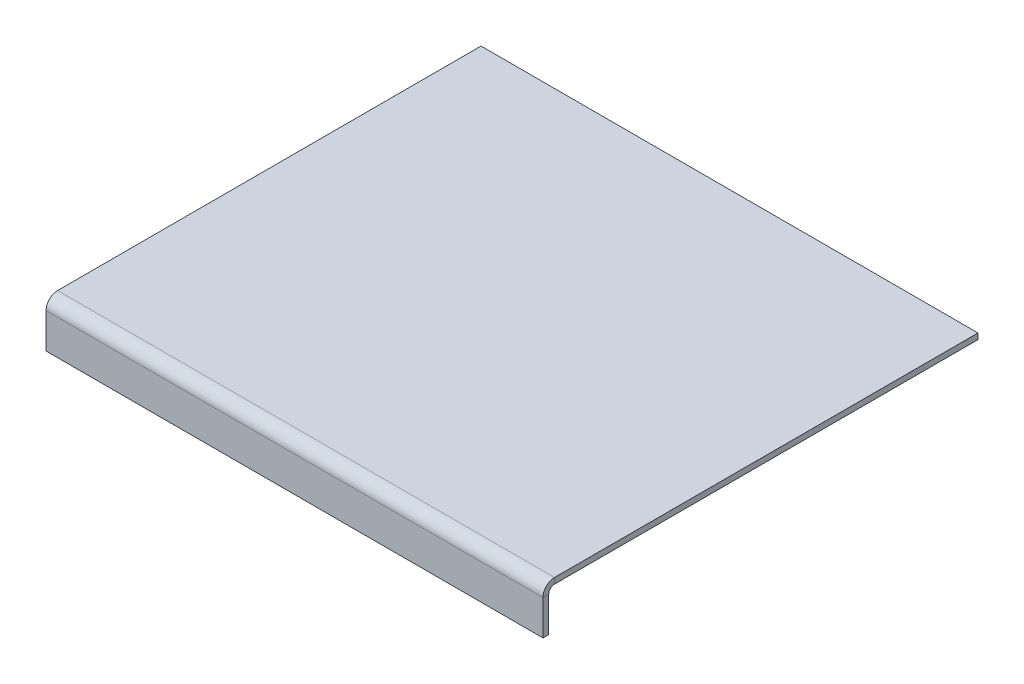
ISO-10303-21;
HEADER;
FILE_DESCRIPTION(('STEP AP214'),'2;1');
FILE_NAME('part.step','',(''),(''),'','','');
FILE_SCHEMA(('AUTOMOTIVE_DESIGN { 1 0 10303 214 1 1 1 1 }'));
ENDSEC;
DATA;
#1=APPLICATION_CONTEXT('core data for automotive mechanical design processes');
#2=APPLICATION_PROTOCOL_DEFINITION('international standard','automotive_design',2000,#1);
#3=PRODUCT_CONTEXT('',#1,'mechanical');
#4=PRODUCT('Part','Part','',(#3));
#5=PRODUCT_RELATED_PRODUCT_CATEGORY('part','',(#4));
#6=PRODUCT_DEFINITION_FORMATION('','',#4);
#7=PRODUCT_DEFINITION_CONTEXT('part definition',#1,'design');
#8=PRODUCT_DEFINITION('design','',#6,#7);
#9=PRODUCT_DEFINITION_SHAPE('','',#8);
#10=(LENGTH_UNIT() NAMED_UNIT(*) SI_UNIT(.MILLI.,.METRE.));
#11=(NAMED_UNIT(*) PLANE_ANGLE_UNIT() SI_UNIT($,.RADIAN.));
#12=(NAMED_UNIT(*) SI_UNIT($,.STERADIAN.) SOLID_ANGLE_UNIT());
#13=UNCERTAINTY_MEASURE_WITH_UNIT(LENGTH_MEASURE(1.E-05),#10,'distance_accuracy_value','');
#14=(GEOMETRIC_REPRESENTATION_CONTEXT(3) GLOBAL_UNCERTAINTY_ASSIGNED_CONTEXT((#13)) GLOBAL_UNIT_ASSIGNED_CONTEXT((#10,
#11,#12)) REPRESENTATION_CONTEXT('',''));
#15=CARTESIAN_POINT('',(0.,0.,0.));
#16=DIRECTION('',(0.,0.,1.));
#17=DIRECTION('',(1.,0.,0.));
#18=AXIS2_PLACEMENT_3D('',#15,#16,#17);
#19=CARTESIAN_POINT('',(-101.6,-2.3622,87.757));
#20=DIRECTION('',(-1.,0.,0.));
#21=DIRECTION('',(0.,0.,1.));
#22=AXIS2_PLACEMENT_3D('',#19,#20,#21);
#23=PLANE('',#22);
#24=DIRECTION('',(0.,0.,1.));
#25=VECTOR('',#24,1.);
#26=CARTESIAN_POINT('',(-101.6,-2.3622,87.757));
#27=LINE('',#26,#25);
#28=CARTESIAN_POINT('',(-101.6,-2.3622,-87.757));
#29=VERTEX_POINT('',#28);
#30=CARTESIAN_POINT('',(-101.6,-2.36219999999999,85.3970000000001));
#31=VERTEX_POINT('',#30);
#32=EDGE_CURVE('E96',#29,#31,#27,.T.);
#33=ORIENTED_EDGE('',*,*,#32,.T.);
#34=DIRECTION('',(0.,1.,0.));
#35=VECTOR('',#34,1.);
#36=CARTESIAN_POINT('',(-101.6,-2.36219999999999,85.3970000000001));
#37=LINE('',#36,#35);
#38=CARTESIAN_POINT('',(-101.6,0.,85.3970000000001));
#39=VERTEX_POINT('',#38);
#40=EDGE_CURVE('E87',#31,#39,#37,.T.);
#41=ORIENTED_EDGE('',*,*,#40,.T.);
#42=DIRECTION('',(0.,0.,1.));
#43=VECTOR('',#42,1.);
#44=CARTESIAN_POINT('',(-101.6,0.,87.757));
#45=LINE('',#44,#43);
#46=CARTESIAN_POINT('',(-101.6,0.,-87.757));
#47=VERTEX_POINT('',#46);
#48=EDGE_CURVE('E85',#47,#39,#45,.T.);
#49=ORIENTED_EDGE('',*,*,#48,.F.);
#50=DIRECTION('',(0.,1.,0.));
#51=VECTOR('',#50,1.);
#52=CARTESIAN_POINT('',(-101.6,-2.3622,-87.757));
#53=LINE('',#52,#51);
#54=EDGE_CURVE('E11',#29,#47,#53,.T.);
#55=ORIENTED_EDGE('',*,*,#54,.F.);
#56=EDGE_LOOP('',(#33,#41,#49,#55));
#57=FACE_BOUND('',#56,.T.);
#58=ADVANCED_FACE('F43',(#57),#23,.T.);
#59=CARTESIAN_POINT('',(0.,-2.3622,0.));
#60=DIRECTION('',(0.,1.,0.));
#61=DIRECTION('',(0.,0.,1.));
#62=AXIS2_PLACEMENT_3D('',#59,#60,#61);
#63=PLANE('',#62);
#64=DIRECTION('',(-1.,0.,0.));
#65=VECTOR('',#64,1.);
#66=CARTESIAN_POINT('',(-101.6,-2.36219999999999,85.3970000000001));
#67=LINE('',#66,#65);
#68=CARTESIAN_POINT('',(101.6,-2.36219999999999,85.3970000000001));
#69=VERTEX_POINT('',#68);
#70=EDGE_CURVE('E109',#31,#69,#67,.F.);
#71=ORIENTED_EDGE('',*,*,#70,.F.);
#72=ORIENTED_EDGE('',*,*,#32,.F.);
#73=DIRECTION('',(-1.,0.,0.));
#74=VECTOR('',#73,1.);
#75=CARTESIAN_POINT('',(101.6,-2.3622,-87.757));
#76=LINE('',#75,#74);
#77=CARTESIAN_POINT('',(101.6,-2.3622,-87.757));
#78=VERTEX_POINT('',#77);
#79=EDGE_CURVE('E82',#78,#29,#76,.T.);
#80=ORIENTED_EDGE('',*,*,#79,.F.);
#81=DIRECTION('',(0.,0.,-1.));
#82=VECTOR('',#81,1.);
#83=CARTESIAN_POINT('',(101.6,-2.3622,87.757));
#84=LINE('',#83,#82);
#85=EDGE_CURVE('E98',#69,#78,#84,.T.);
#86=ORIENTED_EDGE('',*,*,#85,.F.);
#87=EDGE_LOOP('',(#71,#72,#80,#86));
#88=FACE_BOUND('',#87,.T.);
#89=ADVANCED_FACE('F213',(#88),#63,.F.);
#90=CARTESIAN_POINT('',(0.,0.,0.));
#91=DIRECTION('',(0.,1.,0.));
#92=DIRECTION('',(0.,0.,1.));
#93=AXIS2_PLACEMENT_3D('',#90,#91,#92);
#94=PLANE('',#93);
#95=ORIENTED_EDGE('',*,*,#48,.T.);
#96=DIRECTION('',(-1.,0.,0.));
#97=VECTOR('',#96,1.);
#98=CARTESIAN_POINT('',(-101.6,0.,85.3970000000001));
#99=LINE('',#98,#97);
#100=CARTESIAN_POINT('',(101.6,0.,85.3970000000001));
#101=VERTEX_POINT('',#100);
#102=EDGE_CURVE('E119',#39,#101,#99,.F.);
#103=ORIENTED_EDGE('',*,*,#102,.T.);
#104=DIRECTION('',(0.,0.,-1.));
#105=VECTOR('',#104,1.);
#106=CARTESIAN_POINT('',(101.6,0.,87.757));
#107=LINE('',#106,#105);
#108=CARTESIAN_POINT('',(101.6,0.,-87.757));
#109=VERTEX_POINT('',#108);
#110=EDGE_CURVE('E90',#101,#109,#107,.T.);
#111=ORIENTED_EDGE('',*,*,#110,.T.);
#112=DIRECTION('',(-1.,0.,0.));
#113=VECTOR('',#112,1.);
#114=CARTESIAN_POINT('',(101.6,0.,-87.757));
#115=LINE('',#114,#113);
#116=EDGE_CURVE('E80',#109,#47,#115,.T.);
#117=ORIENTED_EDGE('',*,*,#116,.T.);
#118=EDGE_LOOP('',(#95,#103,#111,#117));
#119=FACE_BOUND('',#118,.T.);
#120=ADVANCED_FACE('F93',(#119),#94,.T.);
#121=CARTESIAN_POINT('',(101.6,-2.3622,-87.757));
#122=DIRECTION('',(0.,0.,-1.));
#123=DIRECTION('',(-1.,0.,0.));
#124=AXIS2_PLACEMENT_3D('',#121,#122,#123);
#125=PLANE('',#124);
#126=ORIENTED_EDGE('',*,*,#116,.F.);
#127=DIRECTION('',(0.,1.,0.));
#128=VECTOR('',#127,1.);
#129=CARTESIAN_POINT('',(101.6,-2.3622,-87.757));
#130=LINE('',#129,#128);
#131=EDGE_CURVE('E46',#78,#109,#130,.T.);
#132=ORIENTED_EDGE('',*,*,#131,.F.);
#133=ORIENTED_EDGE('',*,*,#79,.T.);
#134=ORIENTED_EDGE('',*,*,#54,.T.);
#135=EDGE_LOOP('',(#126,#132,#133,#134));
#136=FACE_BOUND('',#135,.T.);
#137=ADVANCED_FACE('F77',(#136),#125,.T.);
#138=CARTESIAN_POINT('',(101.6,-2.3622,87.757));
#139=DIRECTION('',(1.,0.,0.));
#140=DIRECTION('',(0.,0.,-1.));
#141=AXIS2_PLACEMENT_3D('',#138,#139,#140);
#142=PLANE('',#141);
#143=DIRECTION('',(0.,1.,0.));
#144=VECTOR('',#143,1.);
#145=CARTESIAN_POINT('',(101.6,-2.36219999999999,85.3970000000001));
#146=LINE('',#145,#144);
#147=EDGE_CURVE('E91',#69,#101,#146,.T.);
#148=ORIENTED_EDGE('',*,*,#147,.F.);
#149=ORIENTED_EDGE('',*,*,#85,.T.);
#150=ORIENTED_EDGE('',*,*,#131,.T.);
#151=ORIENTED_EDGE('',*,*,#110,.F.);
#152=EDGE_LOOP('',(#148,#149,#150,#151));
#153=FACE_BOUND('',#152,.T.);
#154=ADVANCED_FACE('F210',(#153),#142,.T.);
#155=CARTESIAN_POINT('',(101.6,-4.72219999999998,85.397));
#156=DIRECTION('',(1.,0.,0.));
#157=DIRECTION('',(0.,0.,-1.));
#158=AXIS2_PLACEMENT_3D('',#155,#156,#157);
#159=PLANE('',#158);
#160=DIRECTION('',(0.,0.,1.));
#161=VECTOR('',#160,1.);
#162=CARTESIAN_POINT('',(101.6,-4.72219999999998,87.757));
#163=LINE('',#162,#161);
#164=CARTESIAN_POINT('',(101.6,-4.72219999999997,87.757));
#165=VERTEX_POINT('',#164);
#166=CARTESIAN_POINT('',(101.6,-4.72219999999997,90.1192));
#167=VERTEX_POINT('',#166);
#168=EDGE_CURVE('E148',#165,#167,#163,.T.);
#169=ORIENTED_EDGE('',*,*,#168,.F.);
#170=CARTESIAN_POINT('',(101.6,-4.72219999999998,85.397));
#171=DIRECTION('',(-1.,0.,0.));
#172=DIRECTION('',(0.,0.,1.));
#173=AXIS2_PLACEMENT_3D('',#170,#171,#172);
#174=CIRCLE('',#173,2.35999999999999);
#175=EDGE_CURVE('E113',#69,#165,#174,.F.);
#176=ORIENTED_EDGE('',*,*,#175,.F.);
#177=ORIENTED_EDGE('',*,*,#147,.T.);
#178=CARTESIAN_POINT('',(101.6,-4.72219999999998,85.397));
#179=DIRECTION('',(-1.,0.,0.));
#180=DIRECTION('',(0.,0.,1.));
#181=AXIS2_PLACEMENT_3D('',#178,#179,#180);
#182=CIRCLE('',#181,4.72219999999999);
#183=EDGE_CURVE('E57',#101,#167,#182,.F.);
#184=ORIENTED_EDGE('',*,*,#183,.T.);
#185=EDGE_LOOP('',(#169,#176,#177,#184));
#186=FACE_BOUND('',#185,.T.);
#187=ADVANCED_FACE('F201',(#186),#159,.T.);
#188=CARTESIAN_POINT('',(-101.6,-4.72219999999998,85.397));
#189=DIRECTION('',(1.,0.,0.));
#190=DIRECTION('',(0.,0.,-1.));
#191=AXIS2_PLACEMENT_3D('',#188,#189,#190);
#192=PLANE('',#191);
#193=CARTESIAN_POINT('',(-101.6,-4.72219999999998,85.397));
#194=DIRECTION('',(-1.,0.,0.));
#195=DIRECTION('',(0.,0.,1.));
#196=AXIS2_PLACEMENT_3D('',#193,#194,#195);
#197=CIRCLE('',#196,2.35999999999999);
#198=CARTESIAN_POINT('',(-101.6,-4.72219999999997,87.757));
#199=VERTEX_POINT('',#198);
#200=EDGE_CURVE('E106',#199,#31,#197,.T.);
#201=ORIENTED_EDGE('',*,*,#200,.F.);
#202=DIRECTION('',(0.,0.,1.));
#203=VECTOR('',#202,1.);
#204=CARTESIAN_POINT('',(-101.6,-4.72219999999998,87.7570000000001));
#205=LINE('',#204,#203);
#206=CARTESIAN_POINT('',(-101.6,-4.72219999999998,90.1192));
#207=VERTEX_POINT('',#206);
#208=EDGE_CURVE('E147',#199,#207,#205,.T.);
#209=ORIENTED_EDGE('',*,*,#208,.T.);
#210=CARTESIAN_POINT('',(-101.6,-4.72219999999998,85.397));
#211=DIRECTION('',(-1.,0.,0.));
#212=DIRECTION('',(0.,0.,1.));
#213=AXIS2_PLACEMENT_3D('',#210,#211,#212);
#214=CIRCLE('',#213,4.72219999999999);
#215=EDGE_CURVE('E116',#207,#39,#214,.T.);
#216=ORIENTED_EDGE('',*,*,#215,.T.);
#217=ORIENTED_EDGE('',*,*,#40,.F.);
#218=EDGE_LOOP('',(#201,#209,#216,#217));
#219=FACE_BOUND('',#218,.T.);
#220=ADVANCED_FACE('F169',(#219),#192,.F.);
#221=CARTESIAN_POINT('',(-101.6,-4.72219999999998,85.397));
#222=DIRECTION('',(-1.,0.,0.));
#223=DIRECTION('',(0.,0.,1.));
#224=AXIS2_PLACEMENT_3D('',#221,#222,#223);
#225=CYLINDRICAL_SURFACE('',#224,4.72219999999999);
#226=ORIENTED_EDGE('',*,*,#102,.F.);
#227=ORIENTED_EDGE('',*,*,#215,.F.);
#228=DIRECTION('',(1.,0.,0.));
#229=VECTOR('',#228,1.);
#230=CARTESIAN_POINT('',(0.,-4.72219999999998,90.1192));
#231=LINE('',#230,#229);
#232=EDGE_CURVE('E138',#207,#167,#231,.T.);
#233=ORIENTED_EDGE('',*,*,#232,.T.);
#234=ORIENTED_EDGE('',*,*,#183,.F.);
#235=EDGE_LOOP('',(#226,#227,#233,#234));
#236=FACE_BOUND('',#235,.T.);
#237=ADVANCED_FACE('F208',(#236),#225,.T.);
#238=CARTESIAN_POINT('',(-101.6,-4.72219999999998,85.397));
#239=DIRECTION('',(-1.,0.,0.));
#240=DIRECTION('',(0.,0.,1.));
#241=AXIS2_PLACEMENT_3D('',#238,#239,#240);
#242=CYLINDRICAL_SURFACE('',#241,2.35999999999999);
#243=ORIENTED_EDGE('',*,*,#70,.T.);
#244=ORIENTED_EDGE('',*,*,#175,.T.);
#245=DIRECTION('',(-1.,0.,0.));
#246=VECTOR('',#245,1.);
#247=CARTESIAN_POINT('',(101.6,-4.72219999999998,87.757));
#248=LINE('',#247,#246);
#249=EDGE_CURVE('E151',#165,#199,#248,.T.);
#250=ORIENTED_EDGE('',*,*,#249,.T.);
#251=ORIENTED_EDGE('',*,*,#200,.T.);
#252=EDGE_LOOP('',(#243,#244,#250,#251));
#253=FACE_BOUND('',#252,.T.);
#254=ADVANCED_FACE('F159',(#253),#242,.F.);
#255=CARTESIAN_POINT('',(-101.6,-19.05,90.1192000000001));
#256=DIRECTION('',(1.,0.,0.));
#257=DIRECTION('',(0.,1.,0.));
#258=AXIS2_PLACEMENT_3D('',#255,#256,#257);
#259=PLANE('',#258);
#260=ORIENTED_EDGE('',*,*,#208,.F.);
#261=DIRECTION('',(0.,-1.,0.));
#262=VECTOR('',#261,1.);
#263=CARTESIAN_POINT('',(-101.6,-19.05,87.7570000000001));
#264=LINE('',#263,#262);
#265=CARTESIAN_POINT('',(-101.6,-19.05,87.7570000000001));
#266=VERTEX_POINT('',#265);
#267=EDGE_CURVE('E135',#199,#266,#264,.T.);
#268=ORIENTED_EDGE('',*,*,#267,.T.);
#269=DIRECTION('',(0.,0.,-1.));
#270=VECTOR('',#269,1.);
#271=CARTESIAN_POINT('',(-101.6,-19.05,90.1192000000001));
#272=LINE('',#271,#270);
#273=CARTESIAN_POINT('',(-101.6,-19.05,90.1192000000001));
#274=VERTEX_POINT('',#273);
#275=EDGE_CURVE('E110',#274,#266,#272,.T.);
#276=ORIENTED_EDGE('',*,*,#275,.F.);
#277=DIRECTION('',(0.,-1.,0.));
#278=VECTOR('',#277,1.);
#279=CARTESIAN_POINT('',(-101.6,-19.05,90.1192000000001));
#280=LINE('',#279,#278);
#281=EDGE_CURVE('E131',#207,#274,#280,.T.);
#282=ORIENTED_EDGE('',*,*,#281,.F.);
#283=EDGE_LOOP('',(#260,#268,#276,#282));
#284=FACE_BOUND('',#283,.T.);
#285=ADVANCED_FACE('F174',(#284),#259,.F.);
#286=CARTESIAN_POINT('',(101.6,-2.36219999999999,90.1192));
#287=DIRECTION('',(-1.,0.,0.));
#288=DIRECTION('',(0.,-1.,0.));
#289=AXIS2_PLACEMENT_3D('',#286,#287,#288);
#290=PLANE('',#289);
#291=ORIENTED_EDGE('',*,*,#168,.T.);
#292=DIRECTION('',(0.,1.,0.));
#293=VECTOR('',#292,1.);
#294=CARTESIAN_POINT('',(101.6,-2.36219999999999,90.1192));
#295=LINE('',#294,#293);
#296=CARTESIAN_POINT('',(101.6,-19.05,90.1192000000001));
#297=VERTEX_POINT('',#296);
#298=EDGE_CURVE('E127',#297,#167,#295,.T.);
#299=ORIENTED_EDGE('',*,*,#298,.F.);
#300=DIRECTION('',(0.,0.,-1.));
#301=VECTOR('',#300,1.);
#302=CARTESIAN_POINT('',(101.6,-19.05,90.1192000000001));
#303=LINE('',#302,#301);
#304=CARTESIAN_POINT('',(101.6,-19.05,87.7570000000001));
#305=VERTEX_POINT('',#304);
#306=EDGE_CURVE('E124',#297,#305,#303,.T.);
#307=ORIENTED_EDGE('',*,*,#306,.T.);
#308=DIRECTION('',(0.,1.,0.));
#309=VECTOR('',#308,1.);
#310=CARTESIAN_POINT('',(101.6,-2.3622,87.757));
#311=LINE('',#310,#309);
#312=EDGE_CURVE('E128',#305,#165,#311,.T.);
#313=ORIENTED_EDGE('',*,*,#312,.T.);
#314=EDGE_LOOP('',(#291,#299,#307,#313));
#315=FACE_BOUND('',#314,.T.);
#316=ADVANCED_FACE('F205',(#315),#290,.F.);
#317=CARTESIAN_POINT('',(0.,3.00166949370816E-13,90.1192));
#318=DIRECTION('',(0.,0.,-1.));
#319=DIRECTION('',(0.,1.,0.));
#320=AXIS2_PLACEMENT_3D('',#317,#318,#319);
#321=PLANE('',#320);
#322=ORIENTED_EDGE('',*,*,#232,.F.);
#323=ORIENTED_EDGE('',*,*,#281,.T.);
#324=DIRECTION('',(1.,0.,0.));
#325=VECTOR('',#324,1.);
#326=CARTESIAN_POINT('',(101.6,-19.05,90.1192000000001));
#327=LINE('',#326,#325);
#328=EDGE_CURVE('E141',#274,#297,#327,.T.);
#329=ORIENTED_EDGE('',*,*,#328,.T.);
#330=ORIENTED_EDGE('',*,*,#298,.T.);
#331=EDGE_LOOP('',(#322,#323,#329,#330));
#332=FACE_BOUND('',#331,.T.);
#333=ADVANCED_FACE('F206',(#332),#321,.F.);
#334=CARTESIAN_POINT('',(0.,2.919193721522E-13,87.757));
#335=DIRECTION('',(0.,0.,-1.));
#336=DIRECTION('',(0.,1.,0.));
#337=AXIS2_PLACEMENT_3D('',#334,#335,#336);
#338=PLANE('',#337);
#339=ORIENTED_EDGE('',*,*,#267,.F.);
#340=ORIENTED_EDGE('',*,*,#249,.F.);
#341=ORIENTED_EDGE('',*,*,#312,.F.);
#342=DIRECTION('',(1.,0.,0.));
#343=VECTOR('',#342,1.);
#344=CARTESIAN_POINT('',(101.6,-19.05,87.7570000000001));
#345=LINE('',#344,#343);
#346=EDGE_CURVE('E132',#266,#305,#345,.T.);
#347=ORIENTED_EDGE('',*,*,#346,.F.);
#348=EDGE_LOOP('',(#339,#340,#341,#347));
#349=FACE_BOUND('',#348,.T.);
#350=ADVANCED_FACE('F178',(#349),#338,.T.);
#351=CARTESIAN_POINT('',(101.6,-19.05,90.1192000000001));
#352=DIRECTION('',(0.,1.,0.));
#353=DIRECTION('',(0.,0.,1.));
#354=AXIS2_PLACEMENT_3D('',#351,#352,#353);
#355=PLANE('',#354);
#356=ORIENTED_EDGE('',*,*,#346,.T.);
#357=ORIENTED_EDGE('',*,*,#306,.F.);
#358=ORIENTED_EDGE('',*,*,#328,.F.);
#359=ORIENTED_EDGE('',*,*,#275,.T.);
#360=EDGE_LOOP('',(#356,#357,#358,#359));
#361=FACE_BOUND('',#360,.T.);
#362=ADVANCED_FACE('F184',(#361),#355,.F.);
#363=CLOSED_SHELL('',(#58,#89,#120,#137,#154,#187,#220,#237,#254,#285,#316,#333,#350,#362));
#364=MANIFOLD_SOLID_BREP('B2',#363);
#365=ADVANCED_BREP_SHAPE_REPRESENTATION('',(#18,#364),#14);
#366=SHAPE_DEFINITION_REPRESENTATION(#9,#365);
ENDSEC;
END-ISO-10303-21;
